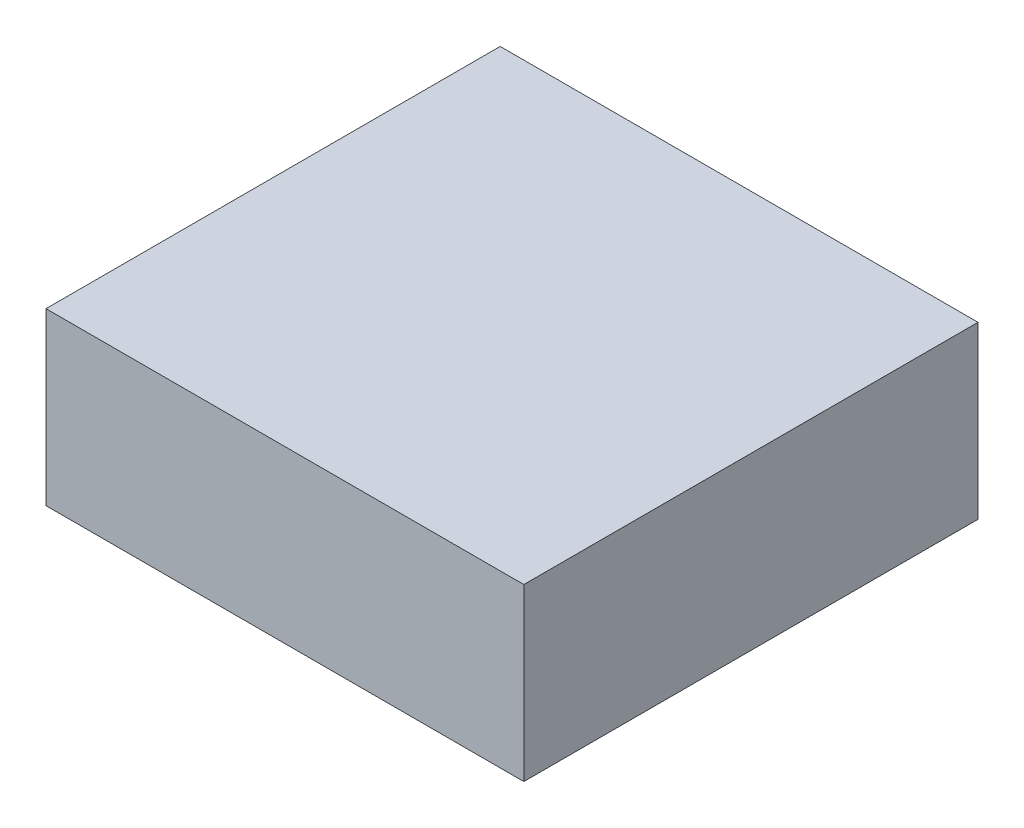
ISO-10303-21;
HEADER;
FILE_DESCRIPTION(('STEP AP214'),'2;1');
FILE_NAME('part.step','',(''),(''),'','','');
FILE_SCHEMA(('AUTOMOTIVE_DESIGN { 1 0 10303 214 1 1 1 1 }'));
ENDSEC;
DATA;
#1=APPLICATION_CONTEXT('core data for automotive mechanical design processes');
#2=APPLICATION_PROTOCOL_DEFINITION('international standard','automotive_design',2000,#1);
#3=PRODUCT_CONTEXT('',#1,'mechanical');
#4=PRODUCT('Part','Part','',(#3));
#5=PRODUCT_RELATED_PRODUCT_CATEGORY('part','',(#4));
#6=PRODUCT_DEFINITION_FORMATION('','',#4);
#7=PRODUCT_DEFINITION_CONTEXT('part definition',#1,'design');
#8=PRODUCT_DEFINITION('design','',#6,#7);
#9=PRODUCT_DEFINITION_SHAPE('','',#8);
#10=(LENGTH_UNIT() NAMED_UNIT(*) SI_UNIT(.MILLI.,.METRE.));
#11=(NAMED_UNIT(*) PLANE_ANGLE_UNIT() SI_UNIT($,.RADIAN.));
#12=(NAMED_UNIT(*) SI_UNIT($,.STERADIAN.) SOLID_ANGLE_UNIT());
#13=UNCERTAINTY_MEASURE_WITH_UNIT(LENGTH_MEASURE(1.E-05),#10,'distance_accuracy_value','');
#14=(GEOMETRIC_REPRESENTATION_CONTEXT(3) GLOBAL_UNCERTAINTY_ASSIGNED_CONTEXT((#13)) GLOBAL_UNIT_ASSIGNED_CONTEXT((#10,
#11,#12)) REPRESENTATION_CONTEXT('',''));
#15=CARTESIAN_POINT('',(0.,0.,0.));
#16=DIRECTION('',(0.,0.,1.));
#17=DIRECTION('',(1.,0.,0.));
#18=AXIS2_PLACEMENT_3D('',#15,#16,#17);
#19=CARTESIAN_POINT('',(-2.823151741295,0.343477955882843,0.));
#20=DIRECTION('',(-1.,0.,0.));
#21=DIRECTION('',(0.,-1.,0.));
#22=AXIS2_PLACEMENT_3D('',#19,#20,#21);
#23=PLANE('',#22);
#24=DIRECTION('',(0.,1.,0.));
#25=VECTOR('',#24,1.);
#26=CARTESIAN_POINT('',(-2.823151741295,0.305904628121138,0.));
#27=LINE('',#26,#25);
#28=CARTESIAN_POINT('',(-2.823151741295,0.305904628121138,0.));
#29=VERTEX_POINT('',#28);
#30=CARTESIAN_POINT('',(-2.823151741295,0.343477955882843,0.));
#31=VERTEX_POINT('',#30);
#32=EDGE_CURVE('E11',#29,#31,#27,.T.);
#33=ORIENTED_EDGE('',*,*,#32,.F.);
#34=DIRECTION('',(0.,0.,1.));
#35=VECTOR('',#34,1.);
#36=CARTESIAN_POINT('',(-2.823151741295,0.305904628121138,0.));
#37=LINE('',#36,#35);
#38=CARTESIAN_POINT('',(-2.823151741295,0.305904628121138,0.1));
#39=VERTEX_POINT('',#38);
#40=EDGE_CURVE('E24',#29,#39,#37,.T.);
#41=ORIENTED_EDGE('',*,*,#40,.T.);
#42=DIRECTION('',(0.,-1.,0.));
#43=VECTOR('',#42,1.);
#44=CARTESIAN_POINT('',(-2.823151741295,0.305904628121138,0.1));
#45=LINE('',#44,#43);
#46=CARTESIAN_POINT('',(-2.823151741295,0.343477955882843,0.1));
#47=VERTEX_POINT('',#46);
#48=EDGE_CURVE('E75',#47,#39,#45,.T.);
#49=ORIENTED_EDGE('',*,*,#48,.F.);
#50=DIRECTION('',(0.,0.,1.));
#51=VECTOR('',#50,1.);
#52=CARTESIAN_POINT('',(-2.823151741295,0.343477955882843,0.));
#53=LINE('',#52,#51);
#54=EDGE_CURVE('E85',#31,#47,#53,.T.);
#55=ORIENTED_EDGE('',*,*,#54,.F.);
#56=EDGE_LOOP('',(#33,#41,#49,#55));
#57=FACE_BOUND('',#56,.T.);
#58=ADVANCED_FACE('F17',(#57),#23,.T.);
#59=CARTESIAN_POINT('',(-2.717946423562,0.343477955882843,0.));
#60=DIRECTION('',(0.,1.,0.));
#61=DIRECTION('',(-1.,0.,0.));
#62=AXIS2_PLACEMENT_3D('',#59,#60,#61);
#63=PLANE('',#62);
#64=DIRECTION('',(1.,0.,0.));
#65=VECTOR('',#64,1.);
#66=CARTESIAN_POINT('',(-2.823151741295,0.343477955882843,0.));
#67=LINE('',#66,#65);
#68=CARTESIAN_POINT('',(-2.717946423562,0.343477955882843,0.));
#69=VERTEX_POINT('',#68);
#70=EDGE_CURVE('E83',#31,#69,#67,.T.);
#71=ORIENTED_EDGE('',*,*,#70,.F.);
#72=ORIENTED_EDGE('',*,*,#54,.T.);
#73=DIRECTION('',(-1.,0.,0.));
#74=VECTOR('',#73,1.);
#75=CARTESIAN_POINT('',(-2.823151741295,0.343477955882843,0.1));
#76=LINE('',#75,#74);
#77=CARTESIAN_POINT('',(-2.717946423562,0.343477955882843,0.1));
#78=VERTEX_POINT('',#77);
#79=EDGE_CURVE('E81',#78,#47,#76,.T.);
#80=ORIENTED_EDGE('',*,*,#79,.F.);
#81=DIRECTION('',(0.,0.,1.));
#82=VECTOR('',#81,1.);
#83=CARTESIAN_POINT('',(-2.717946423562,0.343477955882843,0.));
#84=LINE('',#83,#82);
#85=EDGE_CURVE('E61',#69,#78,#84,.T.);
#86=ORIENTED_EDGE('',*,*,#85,.F.);
#87=EDGE_LOOP('',(#71,#72,#80,#86));
#88=FACE_BOUND('',#87,.T.);
#89=ADVANCED_FACE('F91',(#88),#63,.T.);
#90=CARTESIAN_POINT('',(-2.717946423562,0.305904628121138,0.));
#91=DIRECTION('',(1.,0.,0.));
#92=DIRECTION('',(0.,1.,0.));
#93=AXIS2_PLACEMENT_3D('',#90,#91,#92);
#94=PLANE('',#93);
#95=DIRECTION('',(0.,-1.,0.));
#96=VECTOR('',#95,1.);
#97=CARTESIAN_POINT('',(-2.717946423562,0.343477955882843,0.));
#98=LINE('',#97,#96);
#99=CARTESIAN_POINT('',(-2.717946423562,0.305904628121138,0.));
#100=VERTEX_POINT('',#99);
#101=EDGE_CURVE('E65',#69,#100,#98,.T.);
#102=ORIENTED_EDGE('',*,*,#101,.F.);
#103=ORIENTED_EDGE('',*,*,#85,.T.);
#104=DIRECTION('',(0.,1.,0.));
#105=VECTOR('',#104,1.);
#106=CARTESIAN_POINT('',(-2.717946423562,0.343477955882843,0.1));
#107=LINE('',#106,#105);
#108=CARTESIAN_POINT('',(-2.717946423562,0.305904628121138,0.1));
#109=VERTEX_POINT('',#108);
#110=EDGE_CURVE('E54',#109,#78,#107,.T.);
#111=ORIENTED_EDGE('',*,*,#110,.F.);
#112=DIRECTION('',(0.,0.,1.));
#113=VECTOR('',#112,1.);
#114=CARTESIAN_POINT('',(-2.717946423562,0.305904628121138,0.));
#115=LINE('',#114,#113);
#116=EDGE_CURVE('E58',#100,#109,#115,.T.);
#117=ORIENTED_EDGE('',*,*,#116,.F.);
#118=EDGE_LOOP('',(#102,#103,#111,#117));
#119=FACE_BOUND('',#118,.T.);
#120=ADVANCED_FACE('F57',(#119),#94,.T.);
#121=CARTESIAN_POINT('',(-2.823151741295,0.305904628121138,0.));
#122=DIRECTION('',(0.,-1.,0.));
#123=DIRECTION('',(1.,0.,0.));
#124=AXIS2_PLACEMENT_3D('',#121,#122,#123);
#125=PLANE('',#124);
#126=DIRECTION('',(-1.,0.,0.));
#127=VECTOR('',#126,1.);
#128=CARTESIAN_POINT('',(-2.717946423562,0.305904628121138,0.));
#129=LINE('',#128,#127);
#130=EDGE_CURVE('E71',#100,#29,#129,.T.);
#131=ORIENTED_EDGE('',*,*,#130,.F.);
#132=ORIENTED_EDGE('',*,*,#116,.T.);
#133=DIRECTION('',(1.,0.,0.));
#134=VECTOR('',#133,1.);
#135=CARTESIAN_POINT('',(-2.717946423562,0.305904628121138,0.1));
#136=LINE('',#135,#134);
#137=EDGE_CURVE('E70',#39,#109,#136,.T.);
#138=ORIENTED_EDGE('',*,*,#137,.F.);
#139=ORIENTED_EDGE('',*,*,#40,.F.);
#140=EDGE_LOOP('',(#131,#132,#138,#139));
#141=FACE_BOUND('',#140,.T.);
#142=ADVANCED_FACE('F69',(#141),#125,.T.);
#143=CARTESIAN_POINT('',(-2.770549082429,0.32469129200199,0.));
#144=DIRECTION('',(0.,0.,1.));
#145=DIRECTION('',(1.,0.,0.));
#146=AXIS2_PLACEMENT_3D('',#143,#144,#145);
#147=PLANE('',#146);
#148=ORIENTED_EDGE('',*,*,#130,.T.);
#149=ORIENTED_EDGE('',*,*,#32,.T.);
#150=ORIENTED_EDGE('',*,*,#70,.T.);
#151=ORIENTED_EDGE('',*,*,#101,.T.);
#152=EDGE_LOOP('',(#148,#149,#150,#151));
#153=FACE_BOUND('',#152,.T.);
#154=ADVANCED_FACE('F88',(#153),#147,.F.);
#155=CARTESIAN_POINT('',(-2.770549082429,0.32469129200199,0.1));
#156=DIRECTION('',(0.,0.,1.));
#157=DIRECTION('',(1.,0.,0.));
#158=AXIS2_PLACEMENT_3D('',#155,#156,#157);
#159=PLANE('',#158);
#160=ORIENTED_EDGE('',*,*,#137,.T.);
#161=ORIENTED_EDGE('',*,*,#110,.T.);
#162=ORIENTED_EDGE('',*,*,#79,.T.);
#163=ORIENTED_EDGE('',*,*,#48,.T.);
#164=EDGE_LOOP('',(#160,#161,#162,#163));
#165=FACE_BOUND('',#164,.T.);
#166=ADVANCED_FACE('F74',(#165),#159,.T.);
#167=CLOSED_SHELL('',(#58,#89,#120,#142,#154,#166));
#168=MANIFOLD_SOLID_BREP('B1',#167);
#169=ADVANCED_BREP_SHAPE_REPRESENTATION('',(#18,#168),#14);
#170=SHAPE_DEFINITION_REPRESENTATION(#9,#169);
ENDSEC;
END-ISO-10303-21;
